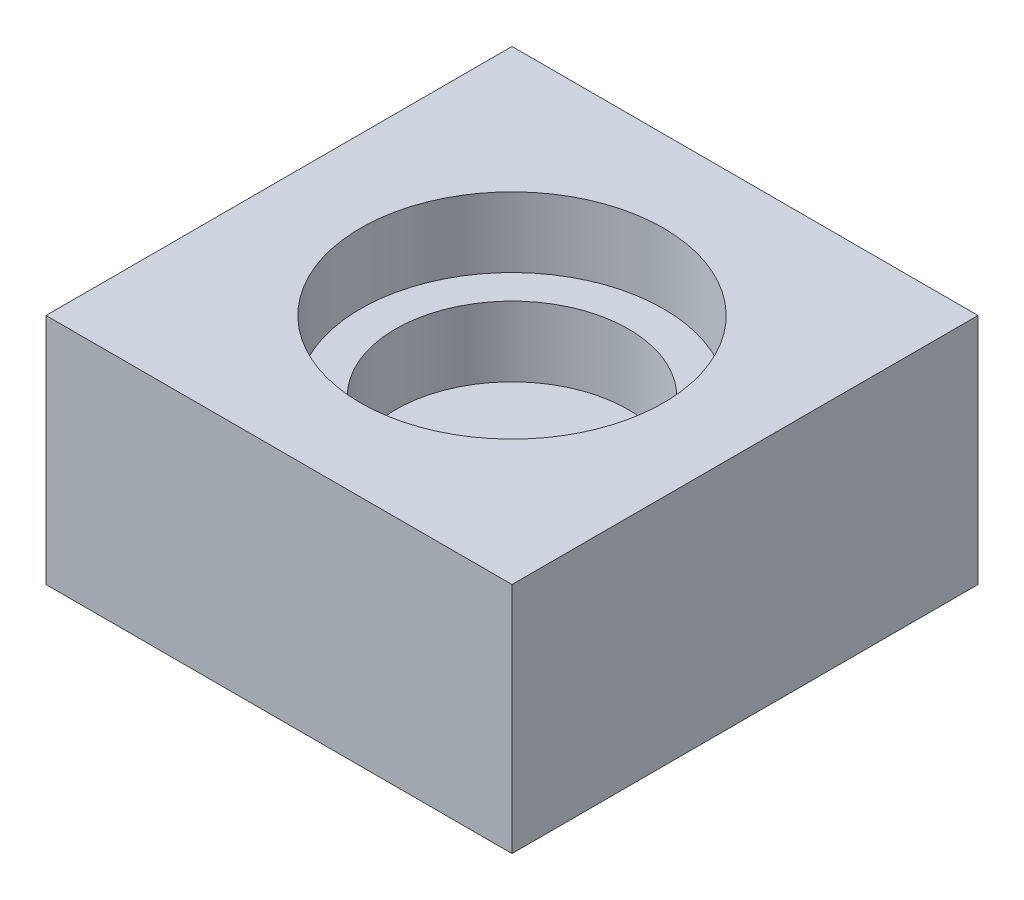
ISO-10303-21;
HEADER;
FILE_DESCRIPTION(('STEP AP214'),'2;1');
FILE_NAME('part.step','',(''),(''),'','','');
FILE_SCHEMA(('AUTOMOTIVE_DESIGN { 1 0 10303 214 1 1 1 1 }'));
ENDSEC;
DATA;
#1=APPLICATION_CONTEXT('core data for automotive mechanical design processes');
#2=APPLICATION_PROTOCOL_DEFINITION('international standard','automotive_design',2000,#1);
#3=PRODUCT_CONTEXT('',#1,'mechanical');
#4=PRODUCT('Part','Part','',(#3));
#5=PRODUCT_RELATED_PRODUCT_CATEGORY('part','',(#4));
#6=PRODUCT_DEFINITION_FORMATION('','',#4);
#7=PRODUCT_DEFINITION_CONTEXT('part definition',#1,'design');
#8=PRODUCT_DEFINITION('design','',#6,#7);
#9=PRODUCT_DEFINITION_SHAPE('','',#8);
#10=(LENGTH_UNIT() NAMED_UNIT(*) SI_UNIT(.MILLI.,.METRE.));
#11=(NAMED_UNIT(*) PLANE_ANGLE_UNIT() SI_UNIT($,.RADIAN.));
#12=(NAMED_UNIT(*) SI_UNIT($,.STERADIAN.) SOLID_ANGLE_UNIT());
#13=UNCERTAINTY_MEASURE_WITH_UNIT(LENGTH_MEASURE(1.E-05),#10,'distance_accuracy_value','');
#14=(GEOMETRIC_REPRESENTATION_CONTEXT(3) GLOBAL_UNCERTAINTY_ASSIGNED_CONTEXT((#13)) GLOBAL_UNIT_ASSIGNED_CONTEXT((#10,
#11,#12)) REPRESENTATION_CONTEXT('',''));
#15=CARTESIAN_POINT('',(0.,0.,0.));
#16=DIRECTION('',(0.,0.,1.));
#17=DIRECTION('',(1.,0.,0.));
#18=AXIS2_PLACEMENT_3D('',#15,#16,#17);
#19=CARTESIAN_POINT('',(0.,20.,0.));
#20=DIRECTION('',(1.,0.,0.));
#21=DIRECTION('',(0.,0.,-1.));
#22=AXIS2_PLACEMENT_3D('',#19,#20,#21);
#23=PLANE('',#22);
#24=DIRECTION('',(0.,0.,1.));
#25=VECTOR('',#24,1.);
#26=CARTESIAN_POINT('',(0.,0.,0.));
#27=LINE('',#26,#25);
#28=CARTESIAN_POINT('',(0.,0.,-40.));
#29=VERTEX_POINT('',#28);
#30=CARTESIAN_POINT('',(0.,0.,0.));
#31=VERTEX_POINT('',#30);
#32=EDGE_CURVE('E98',#29,#31,#27,.T.);
#33=ORIENTED_EDGE('',*,*,#32,.T.);
#34=DIRECTION('',(0.,-1.,0.));
#35=VECTOR('',#34,1.);
#36=CARTESIAN_POINT('',(0.,20.,0.));
#37=LINE('',#36,#35);
#38=CARTESIAN_POINT('',(0.,20.,0.));
#39=VERTEX_POINT('',#38);
#40=EDGE_CURVE('E11',#39,#31,#37,.T.);
#41=ORIENTED_EDGE('',*,*,#40,.F.);
#42=DIRECTION('',(0.,0.,1.));
#43=VECTOR('',#42,1.);
#44=CARTESIAN_POINT('',(0.,20.,0.));
#45=LINE('',#44,#43);
#46=CARTESIAN_POINT('',(0.,20.,-40.));
#47=VERTEX_POINT('',#46);
#48=EDGE_CURVE('E86',#47,#39,#45,.T.);
#49=ORIENTED_EDGE('',*,*,#48,.F.);
#50=DIRECTION('',(0.,-1.,0.));
#51=VECTOR('',#50,1.);
#52=CARTESIAN_POINT('',(0.,20.,-40.));
#53=LINE('',#52,#51);
#54=EDGE_CURVE('E94',#47,#29,#53,.T.);
#55=ORIENTED_EDGE('',*,*,#54,.T.);
#56=EDGE_LOOP('',(#33,#41,#49,#55));
#57=FACE_BOUND('',#56,.T.);
#58=ADVANCED_FACE('F35',(#57),#23,.F.);
#59=CARTESIAN_POINT('',(0.,20.,0.));
#60=DIRECTION('',(0.,0.,-1.));
#61=DIRECTION('',(-1.,0.,0.));
#62=AXIS2_PLACEMENT_3D('',#59,#60,#61);
#63=PLANE('',#62);
#64=DIRECTION('',(1.,0.,0.));
#65=VECTOR('',#64,1.);
#66=CARTESIAN_POINT('',(0.,0.,0.));
#67=LINE('',#66,#65);
#68=CARTESIAN_POINT('',(40.,0.,0.));
#69=VERTEX_POINT('',#68);
#70=EDGE_CURVE('E90',#31,#69,#67,.T.);
#71=ORIENTED_EDGE('',*,*,#70,.T.);
#72=DIRECTION('',(0.,-1.,0.));
#73=VECTOR('',#72,1.);
#74=CARTESIAN_POINT('',(40.,20.,0.));
#75=LINE('',#74,#73);
#76=CARTESIAN_POINT('',(40.,20.,0.));
#77=VERTEX_POINT('',#76);
#78=EDGE_CURVE('E43',#77,#69,#75,.T.);
#79=ORIENTED_EDGE('',*,*,#78,.F.);
#80=DIRECTION('',(1.,0.,0.));
#81=VECTOR('',#80,1.);
#82=CARTESIAN_POINT('',(0.,20.,0.));
#83=LINE('',#82,#81);
#84=EDGE_CURVE('E81',#39,#77,#83,.T.);
#85=ORIENTED_EDGE('',*,*,#84,.F.);
#86=ORIENTED_EDGE('',*,*,#40,.T.);
#87=EDGE_LOOP('',(#71,#79,#85,#86));
#88=FACE_BOUND('',#87,.T.);
#89=ADVANCED_FACE('F89',(#88),#63,.F.);
#90=CARTESIAN_POINT('',(40.,20.,0.));
#91=DIRECTION('',(-1.,0.,0.));
#92=DIRECTION('',(0.,0.,1.));
#93=AXIS2_PLACEMENT_3D('',#90,#91,#92);
#94=PLANE('',#93);
#95=DIRECTION('',(0.,0.,-1.));
#96=VECTOR('',#95,1.);
#97=CARTESIAN_POINT('',(40.,0.,0.));
#98=LINE('',#97,#96);
#99=CARTESIAN_POINT('',(40.,0.,-40.));
#100=VERTEX_POINT('',#99);
#101=EDGE_CURVE('E68',#69,#100,#98,.T.);
#102=ORIENTED_EDGE('',*,*,#101,.T.);
#103=DIRECTION('',(0.,-1.,0.));
#104=VECTOR('',#103,1.);
#105=CARTESIAN_POINT('',(40.,20.,-40.));
#106=LINE('',#105,#104);
#107=CARTESIAN_POINT('',(40.,20.,-40.));
#108=VERTEX_POINT('',#107);
#109=EDGE_CURVE('E91',#108,#100,#106,.T.);
#110=ORIENTED_EDGE('',*,*,#109,.F.);
#111=DIRECTION('',(0.,0.,-1.));
#112=VECTOR('',#111,1.);
#113=CARTESIAN_POINT('',(40.,20.,0.));
#114=LINE('',#113,#112);
#115=EDGE_CURVE('E84',#77,#108,#114,.T.);
#116=ORIENTED_EDGE('',*,*,#115,.F.);
#117=ORIENTED_EDGE('',*,*,#78,.T.);
#118=EDGE_LOOP('',(#102,#110,#116,#117));
#119=FACE_BOUND('',#118,.T.);
#120=ADVANCED_FACE('F92',(#119),#94,.F.);
#121=CARTESIAN_POINT('',(0.,20.,-40.));
#122=DIRECTION('',(0.,0.,1.));
#123=DIRECTION('',(1.,0.,0.));
#124=AXIS2_PLACEMENT_3D('',#121,#122,#123);
#125=PLANE('',#124);
#126=DIRECTION('',(-1.,0.,0.));
#127=VECTOR('',#126,1.);
#128=CARTESIAN_POINT('',(0.,0.,-40.));
#129=LINE('',#128,#127);
#130=EDGE_CURVE('E74',#100,#29,#129,.T.);
#131=ORIENTED_EDGE('',*,*,#130,.T.);
#132=ORIENTED_EDGE('',*,*,#54,.F.);
#133=DIRECTION('',(-1.,0.,0.));
#134=VECTOR('',#133,1.);
#135=CARTESIAN_POINT('',(0.,20.,-40.));
#136=LINE('',#135,#134);
#137=EDGE_CURVE('E51',#108,#47,#136,.T.);
#138=ORIENTED_EDGE('',*,*,#137,.F.);
#139=ORIENTED_EDGE('',*,*,#109,.T.);
#140=EDGE_LOOP('',(#131,#132,#138,#139));
#141=FACE_BOUND('',#140,.T.);
#142=ADVANCED_FACE('F106',(#141),#125,.F.);
#143=CARTESIAN_POINT('',(0.,20.,0.));
#144=DIRECTION('',(0.,-1.,0.));
#145=DIRECTION('',(0.,0.,-1.));
#146=AXIS2_PLACEMENT_3D('',#143,#144,#145);
#147=PLANE('',#146);
#148=CARTESIAN_POINT('',(20.,20.,-20.));
#149=DIRECTION('',(0.,1.,0.));
#150=DIRECTION('',(0.,0.,1.));
#151=AXIS2_PLACEMENT_3D('',#148,#149,#150);
#152=CIRCLE('',#151,13.);
#153=CARTESIAN_POINT('',(20.,20.,-7.));
#154=VERTEX_POINT('',#153);
#155=EDGE_CURVE('E112',#154,#154,#152,.T.);
#156=ORIENTED_EDGE('',*,*,#155,.F.);
#157=EDGE_LOOP('',(#156));
#158=FACE_BOUND('',#157,.T.);
#159=ORIENTED_EDGE('',*,*,#48,.T.);
#160=ORIENTED_EDGE('',*,*,#84,.T.);
#161=ORIENTED_EDGE('',*,*,#115,.T.);
#162=ORIENTED_EDGE('',*,*,#137,.T.);
#163=EDGE_LOOP('',(#159,#160,#161,#162));
#164=FACE_BOUND('',#163,.T.);
#165=ADVANCED_FACE('F82',(#158,#164),#147,.F.);
#166=CARTESIAN_POINT('',(0.,0.,0.));
#167=DIRECTION('',(0.,-1.,0.));
#168=DIRECTION('',(0.,0.,-1.));
#169=AXIS2_PLACEMENT_3D('',#166,#167,#168);
#170=PLANE('',#169);
#171=ORIENTED_EDGE('',*,*,#32,.F.);
#172=ORIENTED_EDGE('',*,*,#130,.F.);
#173=ORIENTED_EDGE('',*,*,#101,.F.);
#174=ORIENTED_EDGE('',*,*,#70,.F.);
#175=EDGE_LOOP('',(#171,#172,#173,#174));
#176=FACE_BOUND('',#175,.T.);
#177=ADVANCED_FACE('F109',(#176),#170,.T.);
#178=CARTESIAN_POINT('',(20.,14.,-20.));
#179=DIRECTION('',(0.,1.,0.));
#180=DIRECTION('',(0.,0.,1.));
#181=AXIS2_PLACEMENT_3D('',#178,#179,#180);
#182=CYLINDRICAL_SURFACE('',#181,13.);
#183=CARTESIAN_POINT('',(20.,14.,-20.));
#184=DIRECTION('',(0.,1.,0.));
#185=DIRECTION('',(0.,0.,1.));
#186=AXIS2_PLACEMENT_3D('',#183,#184,#185);
#187=CIRCLE('',#186,13.);
#188=CARTESIAN_POINT('',(20.,14.,-7.));
#189=VERTEX_POINT('',#188);
#190=EDGE_CURVE('E101',#189,#189,#187,.T.);
#191=ORIENTED_EDGE('',*,*,#190,.F.);
#192=EDGE_LOOP('',(#191));
#193=FACE_BOUND('',#192,.T.);
#194=ORIENTED_EDGE('',*,*,#155,.T.);
#195=EDGE_LOOP('',(#194));
#196=FACE_BOUND('',#195,.T.);
#197=ADVANCED_FACE('F135',(#193,#196),#182,.F.);
#198=CARTESIAN_POINT('',(20.,14.,-20.));
#199=DIRECTION('',(0.,1.,0.));
#200=DIRECTION('',(0.,0.,1.));
#201=AXIS2_PLACEMENT_3D('',#198,#199,#200);
#202=PLANE('',#201);
#203=CARTESIAN_POINT('',(20.,14.,-20.));
#204=DIRECTION('',(0.,1.,0.));
#205=DIRECTION('',(0.,0.,1.));
#206=AXIS2_PLACEMENT_3D('',#203,#204,#205);
#207=CIRCLE('',#206,10.);
#208=CARTESIAN_POINT('',(20.,14.,-10.));
#209=VERTEX_POINT('',#208);
#210=EDGE_CURVE('E118',#209,#209,#207,.T.);
#211=ORIENTED_EDGE('',*,*,#210,.F.);
#212=EDGE_LOOP('',(#211));
#213=FACE_BOUND('',#212,.T.);
#214=ORIENTED_EDGE('',*,*,#190,.T.);
#215=EDGE_LOOP('',(#214));
#216=FACE_BOUND('',#215,.T.);
#217=ADVANCED_FACE('F129',(#213,#216),#202,.T.);
#218=CARTESIAN_POINT('',(20.,8.,-20.));
#219=DIRECTION('',(0.,1.,0.));
#220=DIRECTION('',(0.,0.,1.));
#221=AXIS2_PLACEMENT_3D('',#218,#219,#220);
#222=CYLINDRICAL_SURFACE('',#221,10.);
#223=CARTESIAN_POINT('',(20.,8.,-20.));
#224=DIRECTION('',(0.,1.,0.));
#225=DIRECTION('',(0.,0.,1.));
#226=AXIS2_PLACEMENT_3D('',#223,#224,#225);
#227=CIRCLE('',#226,10.);
#228=CARTESIAN_POINT('',(20.,8.,-10.));
#229=VERTEX_POINT('',#228);
#230=EDGE_CURVE('E115',#229,#229,#227,.T.);
#231=ORIENTED_EDGE('',*,*,#230,.F.);
#232=EDGE_LOOP('',(#231));
#233=FACE_BOUND('',#232,.T.);
#234=ORIENTED_EDGE('',*,*,#210,.T.);
#235=EDGE_LOOP('',(#234));
#236=FACE_BOUND('',#235,.T.);
#237=ADVANCED_FACE('F126',(#233,#236),#222,.F.);
#238=CARTESIAN_POINT('',(20.,8.,-20.));
#239=DIRECTION('',(0.,1.,0.));
#240=DIRECTION('',(0.,0.,1.));
#241=AXIS2_PLACEMENT_3D('',#238,#239,#240);
#242=PLANE('',#241);
#243=ORIENTED_EDGE('',*,*,#230,.T.);
#244=EDGE_LOOP('',(#243));
#245=FACE_BOUND('',#244,.T.);
#246=ADVANCED_FACE('F124',(#245),#242,.T.);
#247=CLOSED_SHELL('',(#58,#89,#120,#142,#165,#177,#197,#217,#237,#246));
#248=MANIFOLD_SOLID_BREP('B2',#247);
#249=ADVANCED_BREP_SHAPE_REPRESENTATION('',(#18,#248),#14);
#250=SHAPE_DEFINITION_REPRESENTATION(#9,#249);
ENDSEC;
END-ISO-10303-21;
